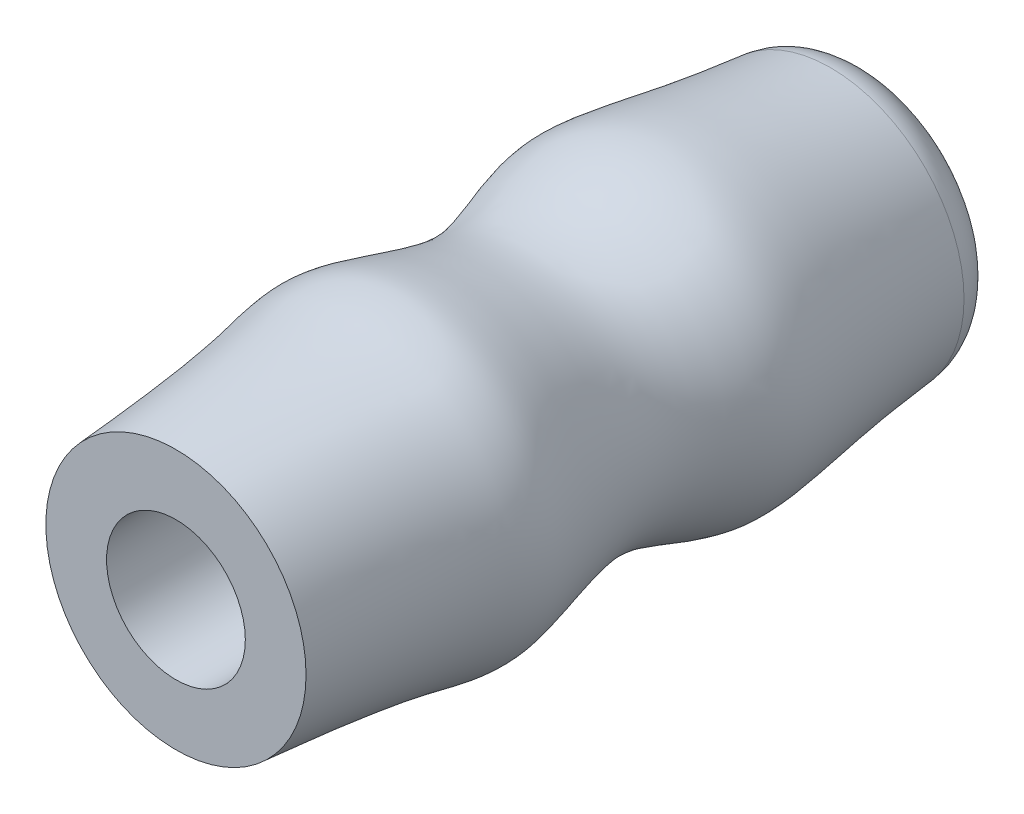
ISO-10303-21;
HEADER;
FILE_DESCRIPTION(('STEP AP214'),'2;1');
FILE_NAME('part.step','',(''),(''),'','','');
FILE_SCHEMA(('AUTOMOTIVE_DESIGN { 1 0 10303 214 1 1 1 1 }'));
ENDSEC;
DATA;
#1=APPLICATION_CONTEXT('core data for automotive mechanical design processes');
#2=APPLICATION_PROTOCOL_DEFINITION('international standard','automotive_design',2000,#1);
#3=PRODUCT_CONTEXT('',#1,'mechanical');
#4=PRODUCT('Part','Part','',(#3));
#5=PRODUCT_RELATED_PRODUCT_CATEGORY('part','',(#4));
#6=PRODUCT_DEFINITION_FORMATION('','',#4);
#7=PRODUCT_DEFINITION_CONTEXT('part definition',#1,'design');
#8=PRODUCT_DEFINITION('design','',#6,#7);
#9=PRODUCT_DEFINITION_SHAPE('','',#8);
#10=(LENGTH_UNIT() NAMED_UNIT(*) SI_UNIT(.MILLI.,.METRE.));
#11=(NAMED_UNIT(*) PLANE_ANGLE_UNIT() SI_UNIT($,.RADIAN.));
#12=(NAMED_UNIT(*) SI_UNIT($,.STERADIAN.) SOLID_ANGLE_UNIT());
#13=UNCERTAINTY_MEASURE_WITH_UNIT(LENGTH_MEASURE(1.E-05),#10,'distance_accuracy_value','');
#14=(GEOMETRIC_REPRESENTATION_CONTEXT(3) GLOBAL_UNCERTAINTY_ASSIGNED_CONTEXT((#13)) GLOBAL_UNIT_ASSIGNED_CONTEXT((#10,
#11,#12)) REPRESENTATION_CONTEXT('',''));
#15=CARTESIAN_POINT('',(0.,0.,0.));
#16=DIRECTION('',(0.,0.,1.));
#17=DIRECTION('',(1.,0.,0.));
#18=AXIS2_PLACEMENT_3D('',#15,#16,#17);
#19=CARTESIAN_POINT('',(-15.,0.,35.1158940397351));
#20=DIRECTION('',(0.,0.,-1.));
#21=DIRECTION('',(-1.,0.,0.));
#22=AXIS2_PLACEMENT_3D('',#19,#20,#21);
#23=PLANE('',#22);
#24=CARTESIAN_POINT('',(0.,0.,35.1158940397351));
#25=DIRECTION('',(0.,0.,1.));
#26=DIRECTION('',(1.,0.,0.));
#27=AXIS2_PLACEMENT_3D('',#24,#25,#26);
#28=CIRCLE('',#27,8.);
#29=CARTESIAN_POINT('',(8.,0.,35.1158940397351));
#30=VERTEX_POINT('',#29);
#31=EDGE_CURVE('E54',#30,#30,#28,.T.);
#32=ORIENTED_EDGE('',*,*,#31,.F.);
#33=EDGE_LOOP('',(#32));
#34=FACE_BOUND('',#33,.T.);
#35=CARTESIAN_POINT('',(0.,0.,35.1158940397351));
#36=DIRECTION('',(0.,0.,1.));
#37=DIRECTION('',(1.,0.,0.));
#38=AXIS2_PLACEMENT_3D('',#35,#36,#37);
#39=CIRCLE('',#38,15.);
#40=CARTESIAN_POINT('',(15.,0.,35.1158940397351));
#41=VERTEX_POINT('',#40);
#42=EDGE_CURVE('E45',#41,#41,#39,.T.);
#43=ORIENTED_EDGE('',*,*,#42,.T.);
#44=EDGE_LOOP('',(#43));
#45=FACE_BOUND('',#44,.T.);
#46=ADVANCED_FACE('F34',(#34,#45),#23,.F.);
#47=CARTESIAN_POINT('',(-15.,0.,-44.884105960265));
#48=CARTESIAN_POINT('',(-16.0804524929509,0.,-29.6087793592536));
#49=CARTESIAN_POINT('',(-20.5221660913357,0.,-17.9356586426326));
#50=CARTESIAN_POINT('',(-12.4357929411569,0.,-6.80587023578364));
#51=CARTESIAN_POINT('',(-18.2076303493602,0.,6.63016631705586));
#52=CARTESIAN_POINT('',(-17.7673517084665,0.,15.3288097854399));
#53=CARTESIAN_POINT('',(-16.4373803288908,0.,16.1971059379502));
#54=CARTESIAN_POINT('',(-15.,0.,35.1158940397351));
#55=B_SPLINE_CURVE_WITH_KNOTS('',3,(#47,#48,#49,#50,#51,#52,#53,#54),.UNSPECIFIED.,.F.,.F.,(4,1,
1,1,1,4),(0.,0.25378724433327,0.480158101508479,0.676866147612042,0.728850337461194,1.),.UNSPECIFIED.);
#56=CARTESIAN_POINT('',(0.,0.,35.1158940397351));
#57=DIRECTION('',(0.,0.,1.));
#58=AXIS1_PLACEMENT('',#56,#57);
#59=SURFACE_OF_REVOLUTION('',#55,#58);
#60=CARTESIAN_POINT('',(0.,0.,-40.3654873527576));
#61=DIRECTION('',(0.,0.,1.));
#62=DIRECTION('',(1.,0.,0.));
#63=AXIS2_PLACEMENT_3D('',#60,#61,#62);
#64=CIRCLE('',#63,15.3773748150339);
#65=CARTESIAN_POINT('',(15.3773748150339,0.,-40.3654873527576));
#66=VERTEX_POINT('',#65);
#67=EDGE_CURVE('E41',#66,#66,#64,.T.);
#68=ORIENTED_EDGE('',*,*,#67,.T.);
#69=EDGE_LOOP('',(#68));
#70=FACE_BOUND('',#69,.T.);
#71=ORIENTED_EDGE('',*,*,#42,.F.);
#72=EDGE_LOOP('',(#71));
#73=FACE_BOUND('',#72,.T.);
#74=ADVANCED_FACE('F64',(#70,#73),#59,.T.);
#75=CARTESIAN_POINT('',(0.,0.,-44.8841059602649));
#76=DIRECTION('',(0.,0.,1.));
#77=DIRECTION('',(1.,0.,0.));
#78=AXIS2_PLACEMENT_3D('',#75,#76,#77);
#79=PLANE('',#78);
#80=CARTESIAN_POINT('',(0.,0.,-44.8841059602649));
#81=DIRECTION('',(0.,0.,1.));
#82=DIRECTION('',(1.,0.,0.));
#83=AXIS2_PLACEMENT_3D('',#80,#81,#82);
#84=CIRCLE('',#83,10.4006015677418);
#85=CARTESIAN_POINT('',(10.4006015677418,0.,-44.8841059602649));
#86=VERTEX_POINT('',#85);
#87=EDGE_CURVE('E10',#86,#86,#84,.F.);
#88=ORIENTED_EDGE('',*,*,#87,.T.);
#89=EDGE_LOOP('',(#88));
#90=FACE_BOUND('',#89,.T.);
#91=ADVANCED_FACE('F67',(#90),#79,.F.);
#92=CARTESIAN_POINT('',(-8.,0.,-34.8841059602649));
#93=DIRECTION('',(0.,0.,-1.));
#94=DIRECTION('',(-1.,0.,0.));
#95=AXIS2_PLACEMENT_3D('',#92,#93,#94);
#96=PLANE('',#95);
#97=CARTESIAN_POINT('',(0.,0.,-34.8841059602649));
#98=DIRECTION('',(0.,0.,1.));
#99=DIRECTION('',(1.,0.,0.));
#100=AXIS2_PLACEMENT_3D('',#97,#98,#99);
#101=CIRCLE('',#100,8.);
#102=CARTESIAN_POINT('',(8.,0.,-34.8841059602649));
#103=VERTEX_POINT('',#102);
#104=EDGE_CURVE('E49',#103,#103,#101,.T.);
#105=ORIENTED_EDGE('',*,*,#104,.T.);
#106=EDGE_LOOP('',(#105));
#107=FACE_BOUND('',#106,.T.);
#108=ADVANCED_FACE('F80',(#107),#96,.F.);
#109=CARTESIAN_POINT('',(0.,0.,35.1158940397351));
#110=DIRECTION('',(0.,0.,1.));
#111=DIRECTION('',(1.,0.,0.));
#112=AXIS2_PLACEMENT_3D('',#109,#110,#111);
#113=CYLINDRICAL_SURFACE('',#112,8.);
#114=ORIENTED_EDGE('',*,*,#104,.F.);
#115=EDGE_LOOP('',(#114));
#116=FACE_BOUND('',#115,.T.);
#117=ORIENTED_EDGE('',*,*,#31,.T.);
#118=EDGE_LOOP('',(#117));
#119=FACE_BOUND('',#118,.T.);
#120=ADVANCED_FACE('F78',(#116,#119),#113,.F.);
#121=CARTESIAN_POINT('',(0.,0.,-39.8841059602649));
#122=DIRECTION('',(0.,0.,1.));
#123=DIRECTION('',(1.,0.,0.));
#124=AXIS2_PLACEMENT_3D('',#121,#122,#123);
#125=TOROIDAL_SURFACE('',#124,10.4006015677418,5.);
#126=ORIENTED_EDGE('',*,*,#87,.F.);
#127=EDGE_LOOP('',(#126));
#128=FACE_BOUND('',#127,.T.);
#129=ORIENTED_EDGE('',*,*,#67,.F.);
#130=EDGE_LOOP('',(#129));
#131=FACE_BOUND('',#130,.T.);
#132=ADVANCED_FACE('F36',(#128,#131),#125,.T.);
#133=CLOSED_SHELL('',(#46,#74,#91,#108,#120,#132));
#134=MANIFOLD_SOLID_BREP('B2',#133);
#135=ADVANCED_BREP_SHAPE_REPRESENTATION('',(#18,#134),#14);
#136=SHAPE_DEFINITION_REPRESENTATION(#9,#135);
ENDSEC;
END-ISO-10303-21;
